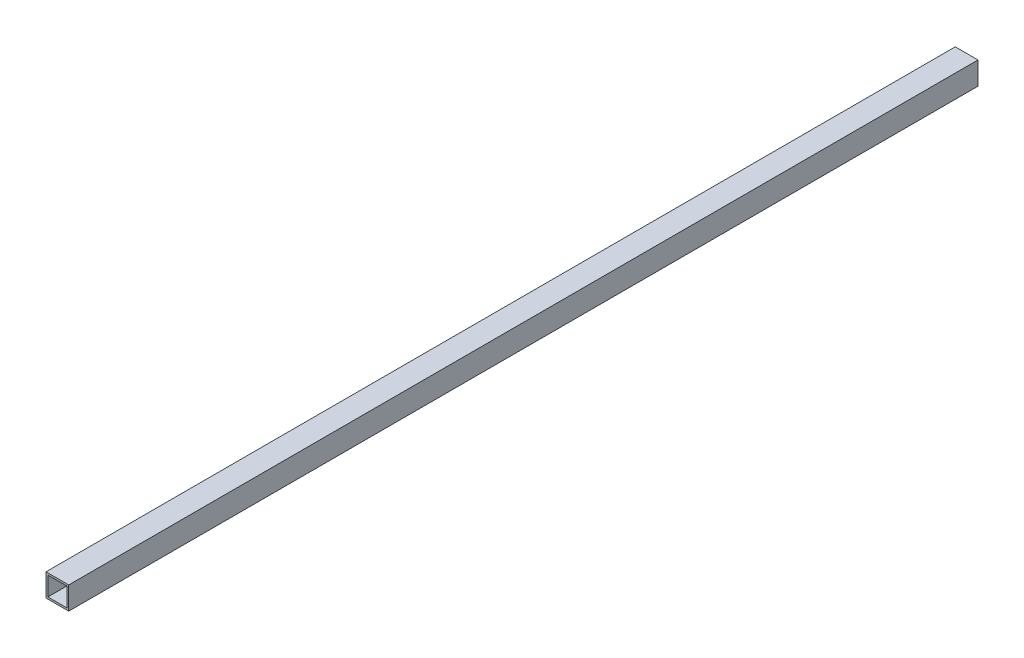
ISO-10303-21;
HEADER;
FILE_DESCRIPTION(('STEP AP214'),'2;1');
FILE_NAME('part.step','',(''),(''),'','','');
FILE_SCHEMA(('AUTOMOTIVE_DESIGN { 1 0 10303 214 1 1 1 1 }'));
ENDSEC;
DATA;
#1=APPLICATION_CONTEXT('core data for automotive mechanical design processes');
#2=APPLICATION_PROTOCOL_DEFINITION('international standard','automotive_design',2000,#1);
#3=PRODUCT_CONTEXT('',#1,'mechanical');
#4=PRODUCT('Part','Part','',(#3));
#5=PRODUCT_RELATED_PRODUCT_CATEGORY('part','',(#4));
#6=PRODUCT_DEFINITION_FORMATION('','',#4);
#7=PRODUCT_DEFINITION_CONTEXT('part definition',#1,'design');
#8=PRODUCT_DEFINITION('design','',#6,#7);
#9=PRODUCT_DEFINITION_SHAPE('','',#8);
#10=(LENGTH_UNIT() NAMED_UNIT(*) SI_UNIT(.MILLI.,.METRE.));
#11=(NAMED_UNIT(*) PLANE_ANGLE_UNIT() SI_UNIT($,.RADIAN.));
#12=(NAMED_UNIT(*) SI_UNIT($,.STERADIAN.) SOLID_ANGLE_UNIT());
#13=UNCERTAINTY_MEASURE_WITH_UNIT(LENGTH_MEASURE(1.E-05),#10,'distance_accuracy_value','');
#14=(GEOMETRIC_REPRESENTATION_CONTEXT(3) GLOBAL_UNCERTAINTY_ASSIGNED_CONTEXT((#13)) GLOBAL_UNIT_ASSIGNED_CONTEXT((#10,
#11,#12)) REPRESENTATION_CONTEXT('',''));
#15=CARTESIAN_POINT('',(0.,0.,0.));
#16=DIRECTION('',(0.,0.,1.));
#17=DIRECTION('',(1.,0.,0.));
#18=AXIS2_PLACEMENT_3D('',#15,#16,#17);
#19=CARTESIAN_POINT('',(0.,0.,381.));
#20=DIRECTION('',(0.,0.,1.));
#21=DIRECTION('',(1.,0.,0.));
#22=AXIS2_PLACEMENT_3D('',#19,#20,#21);
#23=PLANE('',#22);
#24=DIRECTION('',(0.,-1.,0.));
#25=VECTOR('',#24,1.);
#26=CARTESIAN_POINT('',(-9.525,-9.525,381.));
#27=LINE('',#26,#25);
#28=CARTESIAN_POINT('',(-9.525,9.525,381.));
#29=VERTEX_POINT('',#28);
#30=CARTESIAN_POINT('',(-9.525,-9.525,381.));
#31=VERTEX_POINT('',#30);
#32=EDGE_CURVE('E136',#29,#31,#27,.T.);
#33=ORIENTED_EDGE('',*,*,#32,.T.);
#34=DIRECTION('',(1.,0.,0.));
#35=VECTOR('',#34,1.);
#36=CARTESIAN_POINT('',(9.525,-9.525,381.));
#37=LINE('',#36,#35);
#38=CARTESIAN_POINT('',(9.525,-9.525,381.));
#39=VERTEX_POINT('',#38);
#40=EDGE_CURVE('E139',#31,#39,#37,.T.);
#41=ORIENTED_EDGE('',*,*,#40,.T.);
#42=DIRECTION('',(0.,1.,0.));
#43=VECTOR('',#42,1.);
#44=CARTESIAN_POINT('',(9.525,-9.525,381.));
#45=LINE('',#44,#43);
#46=CARTESIAN_POINT('',(9.525,9.525,381.));
#47=VERTEX_POINT('',#46);
#48=EDGE_CURVE('E142',#39,#47,#45,.T.);
#49=ORIENTED_EDGE('',*,*,#48,.T.);
#50=DIRECTION('',(-1.,0.,0.));
#51=VECTOR('',#50,1.);
#52=CARTESIAN_POINT('',(9.525,9.525,381.));
#53=LINE('',#52,#51);
#54=EDGE_CURVE('E144',#47,#29,#53,.T.);
#55=ORIENTED_EDGE('',*,*,#54,.T.);
#56=EDGE_LOOP('',(#33,#41,#49,#55));
#57=FACE_BOUND('',#56,.T.);
#58=DIRECTION('',(1.,0.,0.));
#59=VECTOR('',#58,1.);
#60=CARTESIAN_POINT('',(7.9375,-7.9375,381.));
#61=LINE('',#60,#59);
#62=CARTESIAN_POINT('',(-7.9375,-7.9375,381.));
#63=VERTEX_POINT('',#62);
#64=CARTESIAN_POINT('',(7.9375,-7.9375,381.));
#65=VERTEX_POINT('',#64);
#66=EDGE_CURVE('E108',#63,#65,#61,.T.);
#67=ORIENTED_EDGE('',*,*,#66,.F.);
#68=DIRECTION('',(0.,-1.,0.));
#69=VECTOR('',#68,1.);
#70=CARTESIAN_POINT('',(-7.9375,-7.9375,381.));
#71=LINE('',#70,#69);
#72=CARTESIAN_POINT('',(-7.9375,7.93750000000001,381.));
#73=VERTEX_POINT('',#72);
#74=EDGE_CURVE('E100',#73,#63,#71,.T.);
#75=ORIENTED_EDGE('',*,*,#74,.F.);
#76=DIRECTION('',(-1.,0.,0.));
#77=VECTOR('',#76,1.);
#78=CARTESIAN_POINT('',(7.9375,7.93750000000001,381.));
#79=LINE('',#78,#77);
#80=CARTESIAN_POINT('',(7.9375,7.93750000000001,381.));
#81=VERTEX_POINT('',#80);
#82=EDGE_CURVE('E122',#81,#73,#79,.T.);
#83=ORIENTED_EDGE('',*,*,#82,.F.);
#84=DIRECTION('',(0.,1.,0.));
#85=VECTOR('',#84,1.);
#86=CARTESIAN_POINT('',(7.9375,-7.9375,381.));
#87=LINE('',#86,#85);
#88=EDGE_CURVE('E120',#65,#81,#87,.T.);
#89=ORIENTED_EDGE('',*,*,#88,.F.);
#90=EDGE_LOOP('',(#67,#75,#83,#89));
#91=FACE_BOUND('',#90,.T.);
#92=ADVANCED_FACE('F35',(#57,#91),#23,.T.);
#93=CARTESIAN_POINT('',(0.,0.,-381.));
#94=DIRECTION('',(0.,0.,1.));
#95=DIRECTION('',(1.,0.,0.));
#96=AXIS2_PLACEMENT_3D('',#93,#94,#95);
#97=PLANE('',#96);
#98=DIRECTION('',(0.,-1.,0.));
#99=VECTOR('',#98,1.);
#100=CARTESIAN_POINT('',(-9.525,-9.525,-381.));
#101=LINE('',#100,#99);
#102=CARTESIAN_POINT('',(-9.525,9.525,-381.));
#103=VERTEX_POINT('',#102);
#104=CARTESIAN_POINT('',(-9.525,-9.525,-381.));
#105=VERTEX_POINT('',#104);
#106=EDGE_CURVE('E116',#103,#105,#101,.T.);
#107=ORIENTED_EDGE('',*,*,#106,.F.);
#108=DIRECTION('',(-1.,0.,0.));
#109=VECTOR('',#108,1.);
#110=CARTESIAN_POINT('',(9.525,9.525,-381.));
#111=LINE('',#110,#109);
#112=CARTESIAN_POINT('',(9.525,9.525,-381.));
#113=VERTEX_POINT('',#112);
#114=EDGE_CURVE('E140',#113,#103,#111,.T.);
#115=ORIENTED_EDGE('',*,*,#114,.F.);
#116=DIRECTION('',(0.,1.,0.));
#117=VECTOR('',#116,1.);
#118=CARTESIAN_POINT('',(9.525,-9.525,-381.));
#119=LINE('',#118,#117);
#120=CARTESIAN_POINT('',(9.525,-9.525,-381.));
#121=VERTEX_POINT('',#120);
#122=EDGE_CURVE('E151',#121,#113,#119,.T.);
#123=ORIENTED_EDGE('',*,*,#122,.F.);
#124=DIRECTION('',(1.,0.,0.));
#125=VECTOR('',#124,1.);
#126=CARTESIAN_POINT('',(9.525,-9.525,-381.));
#127=LINE('',#126,#125);
#128=EDGE_CURVE('E149',#105,#121,#127,.T.);
#129=ORIENTED_EDGE('',*,*,#128,.F.);
#130=EDGE_LOOP('',(#107,#115,#123,#129));
#131=FACE_BOUND('',#130,.T.);
#132=DIRECTION('',(0.,-1.,0.));
#133=VECTOR('',#132,1.);
#134=CARTESIAN_POINT('',(-7.9375,-7.9375,-381.));
#135=LINE('',#134,#133);
#136=CARTESIAN_POINT('',(-7.9375,7.93750000000001,-381.));
#137=VERTEX_POINT('',#136);
#138=CARTESIAN_POINT('',(-7.9375,-7.9375,-381.));
#139=VERTEX_POINT('',#138);
#140=EDGE_CURVE('E58',#137,#139,#135,.T.);
#141=ORIENTED_EDGE('',*,*,#140,.T.);
#142=DIRECTION('',(1.,0.,0.));
#143=VECTOR('',#142,1.);
#144=CARTESIAN_POINT('',(7.9375,-7.9375,-381.));
#145=LINE('',#144,#143);
#146=CARTESIAN_POINT('',(7.9375,-7.9375,-381.));
#147=VERTEX_POINT('',#146);
#148=EDGE_CURVE('E115',#139,#147,#145,.T.);
#149=ORIENTED_EDGE('',*,*,#148,.T.);
#150=DIRECTION('',(0.,1.,0.));
#151=VECTOR('',#150,1.);
#152=CARTESIAN_POINT('',(7.9375,-7.9375,-381.));
#153=LINE('',#152,#151);
#154=CARTESIAN_POINT('',(7.9375,7.93750000000001,-381.));
#155=VERTEX_POINT('',#154);
#156=EDGE_CURVE('E128',#147,#155,#153,.T.);
#157=ORIENTED_EDGE('',*,*,#156,.T.);
#158=DIRECTION('',(-1.,0.,0.));
#159=VECTOR('',#158,1.);
#160=CARTESIAN_POINT('',(7.9375,7.93750000000001,-381.));
#161=LINE('',#160,#159);
#162=EDGE_CURVE('E109',#155,#137,#161,.T.);
#163=ORIENTED_EDGE('',*,*,#162,.T.);
#164=EDGE_LOOP('',(#141,#149,#157,#163));
#165=FACE_BOUND('',#164,.T.);
#166=ADVANCED_FACE('F169',(#131,#165),#97,.F.);
#167=CARTESIAN_POINT('',(-9.525,-9.525,381.));
#168=DIRECTION('',(1.,0.,0.));
#169=DIRECTION('',(0.,0.,-1.));
#170=AXIS2_PLACEMENT_3D('',#167,#168,#169);
#171=PLANE('',#170);
#172=ORIENTED_EDGE('',*,*,#106,.T.);
#173=DIRECTION('',(0.,0.,-1.));
#174=VECTOR('',#173,1.);
#175=CARTESIAN_POINT('',(-9.525,-9.525,381.));
#176=LINE('',#175,#174);
#177=EDGE_CURVE('E11',#31,#105,#176,.T.);
#178=ORIENTED_EDGE('',*,*,#177,.F.);
#179=ORIENTED_EDGE('',*,*,#32,.F.);
#180=DIRECTION('',(0.,0.,-1.));
#181=VECTOR('',#180,1.);
#182=CARTESIAN_POINT('',(-9.525,9.525,381.));
#183=LINE('',#182,#181);
#184=EDGE_CURVE('E146',#29,#103,#183,.T.);
#185=ORIENTED_EDGE('',*,*,#184,.T.);
#186=EDGE_LOOP('',(#172,#178,#179,#185));
#187=FACE_BOUND('',#186,.T.);
#188=ADVANCED_FACE('F37',(#187),#171,.F.);
#189=CARTESIAN_POINT('',(9.525,-9.525,381.));
#190=DIRECTION('',(0.,1.,0.));
#191=DIRECTION('',(0.,0.,1.));
#192=AXIS2_PLACEMENT_3D('',#189,#190,#191);
#193=PLANE('',#192);
#194=ORIENTED_EDGE('',*,*,#128,.T.);
#195=DIRECTION('',(0.,0.,-1.));
#196=VECTOR('',#195,1.);
#197=CARTESIAN_POINT('',(9.525,-9.525,381.));
#198=LINE('',#197,#196);
#199=EDGE_CURVE('E43',#39,#121,#198,.T.);
#200=ORIENTED_EDGE('',*,*,#199,.F.);
#201=ORIENTED_EDGE('',*,*,#40,.F.);
#202=ORIENTED_EDGE('',*,*,#177,.T.);
#203=EDGE_LOOP('',(#194,#200,#201,#202));
#204=FACE_BOUND('',#203,.T.);
#205=ADVANCED_FACE('F179',(#204),#193,.F.);
#206=CARTESIAN_POINT('',(9.525,-9.525,381.));
#207=DIRECTION('',(-1.,0.,0.));
#208=DIRECTION('',(0.,0.,1.));
#209=AXIS2_PLACEMENT_3D('',#206,#207,#208);
#210=PLANE('',#209);
#211=ORIENTED_EDGE('',*,*,#122,.T.);
#212=DIRECTION('',(0.,0.,-1.));
#213=VECTOR('',#212,1.);
#214=CARTESIAN_POINT('',(9.525,9.525,381.));
#215=LINE('',#214,#213);
#216=EDGE_CURVE('E156',#47,#113,#215,.T.);
#217=ORIENTED_EDGE('',*,*,#216,.F.);
#218=ORIENTED_EDGE('',*,*,#48,.F.);
#219=ORIENTED_EDGE('',*,*,#199,.T.);
#220=EDGE_LOOP('',(#211,#217,#218,#219));
#221=FACE_BOUND('',#220,.T.);
#222=ADVANCED_FACE('F163',(#221),#210,.F.);
#223=CARTESIAN_POINT('',(9.525,9.525,381.));
#224=DIRECTION('',(0.,-1.,0.));
#225=DIRECTION('',(0.,0.,-1.));
#226=AXIS2_PLACEMENT_3D('',#223,#224,#225);
#227=PLANE('',#226);
#228=ORIENTED_EDGE('',*,*,#114,.T.);
#229=ORIENTED_EDGE('',*,*,#184,.F.);
#230=ORIENTED_EDGE('',*,*,#54,.F.);
#231=ORIENTED_EDGE('',*,*,#216,.T.);
#232=EDGE_LOOP('',(#228,#229,#230,#231));
#233=FACE_BOUND('',#232,.T.);
#234=ADVANCED_FACE('F173',(#233),#227,.F.);
#235=CARTESIAN_POINT('',(-7.9375,-7.9375,381.));
#236=DIRECTION('',(1.,0.,0.));
#237=DIRECTION('',(0.,0.,-1.));
#238=AXIS2_PLACEMENT_3D('',#235,#236,#237);
#239=PLANE('',#238);
#240=ORIENTED_EDGE('',*,*,#140,.F.);
#241=DIRECTION('',(0.,0.,-1.));
#242=VECTOR('',#241,1.);
#243=CARTESIAN_POINT('',(-7.9375,7.93750000000001,381.));
#244=LINE('',#243,#242);
#245=EDGE_CURVE('E104',#73,#137,#244,.T.);
#246=ORIENTED_EDGE('',*,*,#245,.F.);
#247=ORIENTED_EDGE('',*,*,#74,.T.);
#248=DIRECTION('',(0.,0.,-1.));
#249=VECTOR('',#248,1.);
#250=CARTESIAN_POINT('',(-7.9375,-7.9375,381.));
#251=LINE('',#250,#249);
#252=EDGE_CURVE('E103',#63,#139,#251,.T.);
#253=ORIENTED_EDGE('',*,*,#252,.T.);
#254=EDGE_LOOP('',(#240,#246,#247,#253));
#255=FACE_BOUND('',#254,.T.);
#256=ADVANCED_FACE('F102',(#255),#239,.T.);
#257=CARTESIAN_POINT('',(7.9375,-7.9375,381.));
#258=DIRECTION('',(0.,1.,0.));
#259=DIRECTION('',(0.,0.,1.));
#260=AXIS2_PLACEMENT_3D('',#257,#258,#259);
#261=PLANE('',#260);
#262=ORIENTED_EDGE('',*,*,#148,.F.);
#263=ORIENTED_EDGE('',*,*,#252,.F.);
#264=ORIENTED_EDGE('',*,*,#66,.T.);
#265=DIRECTION('',(0.,0.,-1.));
#266=VECTOR('',#265,1.);
#267=CARTESIAN_POINT('',(7.9375,-7.9375,381.));
#268=LINE('',#267,#266);
#269=EDGE_CURVE('E117',#65,#147,#268,.T.);
#270=ORIENTED_EDGE('',*,*,#269,.T.);
#271=EDGE_LOOP('',(#262,#263,#264,#270));
#272=FACE_BOUND('',#271,.T.);
#273=ADVANCED_FACE('F112',(#272),#261,.T.);
#274=CARTESIAN_POINT('',(7.9375,-7.9375,381.));
#275=DIRECTION('',(-1.,0.,0.));
#276=DIRECTION('',(0.,0.,1.));
#277=AXIS2_PLACEMENT_3D('',#274,#275,#276);
#278=PLANE('',#277);
#279=ORIENTED_EDGE('',*,*,#156,.F.);
#280=ORIENTED_EDGE('',*,*,#269,.F.);
#281=ORIENTED_EDGE('',*,*,#88,.T.);
#282=DIRECTION('',(0.,0.,-1.));
#283=VECTOR('',#282,1.);
#284=CARTESIAN_POINT('',(7.9375,7.93750000000001,381.));
#285=LINE('',#284,#283);
#286=EDGE_CURVE('E50',#81,#155,#285,.T.);
#287=ORIENTED_EDGE('',*,*,#286,.T.);
#288=EDGE_LOOP('',(#279,#280,#281,#287));
#289=FACE_BOUND('',#288,.T.);
#290=ADVANCED_FACE('F202',(#289),#278,.T.);
#291=CARTESIAN_POINT('',(7.9375,7.93750000000001,381.));
#292=DIRECTION('',(0.,-1.,0.));
#293=DIRECTION('',(0.,0.,-1.));
#294=AXIS2_PLACEMENT_3D('',#291,#292,#293);
#295=PLANE('',#294);
#296=ORIENTED_EDGE('',*,*,#162,.F.);
#297=ORIENTED_EDGE('',*,*,#286,.F.);
#298=ORIENTED_EDGE('',*,*,#82,.T.);
#299=ORIENTED_EDGE('',*,*,#245,.T.);
#300=EDGE_LOOP('',(#296,#297,#298,#299));
#301=FACE_BOUND('',#300,.T.);
#302=ADVANCED_FACE('F206',(#301),#295,.T.);
#303=CLOSED_SHELL('',(#92,#166,#188,#205,#222,#234,#256,#273,#290,#302));
#304=MANIFOLD_SOLID_BREP('B2',#303);
#305=ADVANCED_BREP_SHAPE_REPRESENTATION('',(#18,#304),#14);
#306=SHAPE_DEFINITION_REPRESENTATION(#9,#305);
ENDSEC;
END-ISO-10303-21;
